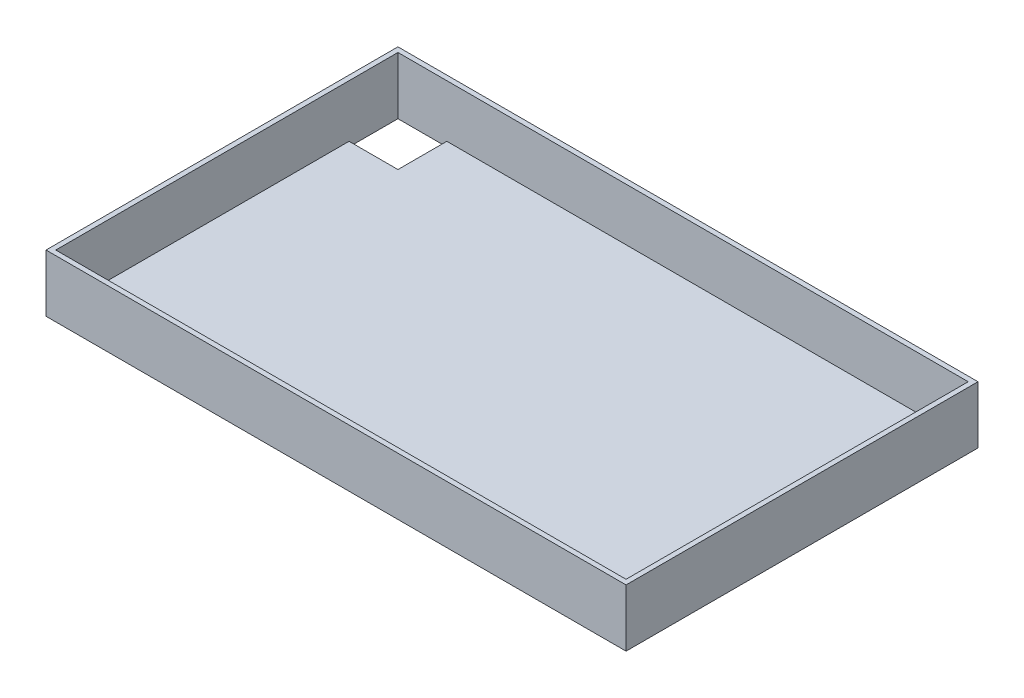
ISO-10303-21;
HEADER;
FILE_DESCRIPTION(('STEP AP214'),'2;1');
FILE_NAME('part.step','',(''),(''),'','','');
FILE_SCHEMA(('AUTOMOTIVE_DESIGN { 1 0 10303 214 1 1 1 1 }'));
ENDSEC;
DATA;
#1=APPLICATION_CONTEXT('core data for automotive mechanical design processes');
#2=APPLICATION_PROTOCOL_DEFINITION('international standard','automotive_design',2000,#1);
#3=PRODUCT_CONTEXT('',#1,'mechanical');
#4=PRODUCT('Part','Part','',(#3));
#5=PRODUCT_RELATED_PRODUCT_CATEGORY('part','',(#4));
#6=PRODUCT_DEFINITION_FORMATION('','',#4);
#7=PRODUCT_DEFINITION_CONTEXT('part definition',#1,'design');
#8=PRODUCT_DEFINITION('design','',#6,#7);
#9=PRODUCT_DEFINITION_SHAPE('','',#8);
#10=(LENGTH_UNIT() NAMED_UNIT(*) SI_UNIT(.MILLI.,.METRE.));
#11=(NAMED_UNIT(*) PLANE_ANGLE_UNIT() SI_UNIT($,.RADIAN.));
#12=(NAMED_UNIT(*) SI_UNIT($,.STERADIAN.) SOLID_ANGLE_UNIT());
#13=UNCERTAINTY_MEASURE_WITH_UNIT(LENGTH_MEASURE(1.E-05),#10,'distance_accuracy_value','');
#14=(GEOMETRIC_REPRESENTATION_CONTEXT(3) GLOBAL_UNCERTAINTY_ASSIGNED_CONTEXT((#13)) GLOBAL_UNIT_ASSIGNED_CONTEXT((#10,
#11,#12)) REPRESENTATION_CONTEXT('',''));
#15=CARTESIAN_POINT('',(0.,0.,0.));
#16=DIRECTION('',(0.,0.,1.));
#17=DIRECTION('',(1.,0.,0.));
#18=AXIS2_PLACEMENT_3D('',#15,#16,#17);
#19=CARTESIAN_POINT('',(0.,-3.,0.));
#20=DIRECTION('',(0.,1.,0.));
#21=DIRECTION('',(0.,0.,1.));
#22=AXIS2_PLACEMENT_3D('',#19,#20,#21);
#23=PLANE('',#22);
#24=DIRECTION('',(0.,0.,1.));
#25=VECTOR('',#24,1.);
#26=CARTESIAN_POINT('',(175.,-3.,105.));
#27=LINE('',#26,#25);
#28=CARTESIAN_POINT('',(175.,-3.,75.));
#29=VERTEX_POINT('',#28);
#30=CARTESIAN_POINT('',(175.,-3.,105.));
#31=VERTEX_POINT('',#30);
#32=EDGE_CURVE('E224',#29,#31,#27,.T.);
#33=ORIENTED_EDGE('',*,*,#32,.F.);
#34=DIRECTION('',(1.,0.,0.));
#35=VECTOR('',#34,1.);
#36=CARTESIAN_POINT('',(175.,-3.,75.));
#37=LINE('',#36,#35);
#38=CARTESIAN_POINT('',(145.,-3.,75.));
#39=VERTEX_POINT('',#38);
#40=EDGE_CURVE('E227',#39,#29,#37,.T.);
#41=ORIENTED_EDGE('',*,*,#40,.F.);
#42=DIRECTION('',(0.,0.,-1.));
#43=VECTOR('',#42,1.);
#44=CARTESIAN_POINT('',(145.,-3.,105.));
#45=LINE('',#44,#43);
#46=CARTESIAN_POINT('',(145.,-3.,105.));
#47=VERTEX_POINT('',#46);
#48=EDGE_CURVE('E230',#47,#39,#45,.T.);
#49=ORIENTED_EDGE('',*,*,#48,.F.);
#50=DIRECTION('',(-1.,0.,0.));
#51=VECTOR('',#50,1.);
#52=CARTESIAN_POINT('',(175.,-3.,105.));
#53=LINE('',#52,#51);
#54=EDGE_CURVE('E233',#31,#47,#53,.T.);
#55=ORIENTED_EDGE('',*,*,#54,.F.);
#56=EDGE_LOOP('',(#33,#41,#49,#55));
#57=FACE_BOUND('',#56,.T.);
#58=DIRECTION('',(1.,0.,0.));
#59=VECTOR('',#58,1.);
#60=CARTESIAN_POINT('',(175.,-3.,-75.));
#61=LINE('',#60,#59);
#62=CARTESIAN_POINT('',(145.,-3.,-75.));
#63=VERTEX_POINT('',#62);
#64=CARTESIAN_POINT('',(175.,-3.,-75.));
#65=VERTEX_POINT('',#64);
#66=EDGE_CURVE('E257',#63,#65,#61,.T.);
#67=ORIENTED_EDGE('',*,*,#66,.T.);
#68=DIRECTION('',(0.,0.,-1.));
#69=VECTOR('',#68,1.);
#70=CARTESIAN_POINT('',(175.,-3.,-105.));
#71=LINE('',#70,#69);
#72=CARTESIAN_POINT('',(175.,-3.,-105.));
#73=VERTEX_POINT('',#72);
#74=EDGE_CURVE('E247',#65,#73,#71,.T.);
#75=ORIENTED_EDGE('',*,*,#74,.T.);
#76=DIRECTION('',(-1.,0.,0.));
#77=VECTOR('',#76,1.);
#78=CARTESIAN_POINT('',(175.,-3.,-105.));
#79=LINE('',#78,#77);
#80=CARTESIAN_POINT('',(145.,-3.,-105.));
#81=VERTEX_POINT('',#80);
#82=EDGE_CURVE('E250',#73,#81,#79,.T.);
#83=ORIENTED_EDGE('',*,*,#82,.T.);
#84=DIRECTION('',(0.,0.,1.));
#85=VECTOR('',#84,1.);
#86=CARTESIAN_POINT('',(145.,-3.,-105.));
#87=LINE('',#86,#85);
#88=EDGE_CURVE('E254',#81,#63,#87,.T.);
#89=ORIENTED_EDGE('',*,*,#88,.T.);
#90=EDGE_LOOP('',(#67,#75,#83,#89));
#91=FACE_BOUND('',#90,.T.);
#92=DIRECTION('',(0.,0.,-1.));
#93=VECTOR('',#92,1.);
#94=CARTESIAN_POINT('',(178.,-3.,-105.));
#95=LINE('',#94,#93);
#96=CARTESIAN_POINT('',(178.,-3.,108.));
#97=VERTEX_POINT('',#96);
#98=CARTESIAN_POINT('',(178.,-3.,-108.));
#99=VERTEX_POINT('',#98);
#100=EDGE_CURVE('E296',#97,#99,#95,.T.);
#101=ORIENTED_EDGE('',*,*,#100,.F.);
#102=DIRECTION('',(1.,0.,0.));
#103=VECTOR('',#102,1.);
#104=CARTESIAN_POINT('',(-175.,-3.,108.));
#105=LINE('',#104,#103);
#106=CARTESIAN_POINT('',(-178.,-3.,108.));
#107=VERTEX_POINT('',#106);
#108=EDGE_CURVE('E309',#107,#97,#105,.T.);
#109=ORIENTED_EDGE('',*,*,#108,.F.);
#110=DIRECTION('',(0.,0.,1.));
#111=VECTOR('',#110,1.);
#112=CARTESIAN_POINT('',(-178.,-3.,-105.));
#113=LINE('',#112,#111);
#114=CARTESIAN_POINT('',(-178.,-3.,-108.));
#115=VERTEX_POINT('',#114);
#116=EDGE_CURVE('E305',#115,#107,#113,.T.);
#117=ORIENTED_EDGE('',*,*,#116,.F.);
#118=DIRECTION('',(-1.,0.,0.));
#119=VECTOR('',#118,1.);
#120=CARTESIAN_POINT('',(-175.,-3.,-108.));
#121=LINE('',#120,#119);
#122=EDGE_CURVE('E298',#99,#115,#121,.T.);
#123=ORIENTED_EDGE('',*,*,#122,.F.);
#124=EDGE_LOOP('',(#101,#109,#117,#123));
#125=FACE_BOUND('',#124,.T.);
#126=DIRECTION('',(-1.,0.,0.));
#127=VECTOR('',#126,1.);
#128=CARTESIAN_POINT('',(-175.,-3.,75.));
#129=LINE('',#128,#127);
#130=CARTESIAN_POINT('',(-145.,-3.,75.));
#131=VERTEX_POINT('',#130);
#132=CARTESIAN_POINT('',(-175.,-3.,75.));
#133=VERTEX_POINT('',#132);
#134=EDGE_CURVE('E210',#131,#133,#129,.T.);
#135=ORIENTED_EDGE('',*,*,#134,.T.);
#136=DIRECTION('',(0.,0.,1.));
#137=VECTOR('',#136,1.);
#138=CARTESIAN_POINT('',(-175.,-3.,105.));
#139=LINE('',#138,#137);
#140=CARTESIAN_POINT('',(-175.,-3.,105.));
#141=VERTEX_POINT('',#140);
#142=EDGE_CURVE('E202',#133,#141,#139,.T.);
#143=ORIENTED_EDGE('',*,*,#142,.T.);
#144=DIRECTION('',(1.,0.,0.));
#145=VECTOR('',#144,1.);
#146=CARTESIAN_POINT('',(-175.,-3.,105.));
#147=LINE('',#146,#145);
#148=CARTESIAN_POINT('',(-145.,-3.,105.));
#149=VERTEX_POINT('',#148);
#150=EDGE_CURVE('E205',#141,#149,#147,.T.);
#151=ORIENTED_EDGE('',*,*,#150,.T.);
#152=DIRECTION('',(0.,0.,-1.));
#153=VECTOR('',#152,1.);
#154=CARTESIAN_POINT('',(-145.,-3.,105.));
#155=LINE('',#154,#153);
#156=EDGE_CURVE('E56',#149,#131,#155,.T.);
#157=ORIENTED_EDGE('',*,*,#156,.T.);
#158=EDGE_LOOP('',(#135,#143,#151,#157));
#159=FACE_BOUND('',#158,.T.);
#160=DIRECTION('',(0.,0.,-1.));
#161=VECTOR('',#160,1.);
#162=CARTESIAN_POINT('',(-175.,-3.,-105.));
#163=LINE('',#162,#161);
#164=CARTESIAN_POINT('',(-175.,-3.,-75.));
#165=VERTEX_POINT('',#164);
#166=CARTESIAN_POINT('',(-175.,-3.,-105.));
#167=VERTEX_POINT('',#166);
#168=EDGE_CURVE('E177',#165,#167,#163,.T.);
#169=ORIENTED_EDGE('',*,*,#168,.F.);
#170=DIRECTION('',(-1.,0.,0.));
#171=VECTOR('',#170,1.);
#172=CARTESIAN_POINT('',(-175.,-3.,-75.));
#173=LINE('',#172,#171);
#174=CARTESIAN_POINT('',(-145.,-3.,-75.));
#175=VERTEX_POINT('',#174);
#176=EDGE_CURVE('E168',#175,#165,#173,.T.);
#177=ORIENTED_EDGE('',*,*,#176,.F.);
#178=DIRECTION('',(0.,0.,1.));
#179=VECTOR('',#178,1.);
#180=CARTESIAN_POINT('',(-145.,-3.,-105.));
#181=LINE('',#180,#179);
#182=CARTESIAN_POINT('',(-145.,-3.,-105.));
#183=VERTEX_POINT('',#182);
#184=EDGE_CURVE('E176',#183,#175,#181,.T.);
#185=ORIENTED_EDGE('',*,*,#184,.F.);
#186=DIRECTION('',(1.,0.,0.));
#187=VECTOR('',#186,1.);
#188=CARTESIAN_POINT('',(-175.,-3.,-105.));
#189=LINE('',#188,#187);
#190=EDGE_CURVE('E187',#167,#183,#189,.T.);
#191=ORIENTED_EDGE('',*,*,#190,.F.);
#192=EDGE_LOOP('',(#169,#177,#185,#191));
#193=FACE_BOUND('',#192,.T.);
#194=ADVANCED_FACE('F32',(#57,#91,#125,#159,#193),#23,.F.);
#195=CARTESIAN_POINT('',(0.,0.,0.));
#196=DIRECTION('',(0.,1.,0.));
#197=DIRECTION('',(0.,0.,1.));
#198=AXIS2_PLACEMENT_3D('',#195,#196,#197);
#199=PLANE('',#198);
#200=DIRECTION('',(-1.,0.,0.));
#201=VECTOR('',#200,1.);
#202=CARTESIAN_POINT('',(-175.,0.,-105.));
#203=LINE('',#202,#201);
#204=CARTESIAN_POINT('',(145.,0.,-105.));
#205=VERTEX_POINT('',#204);
#206=CARTESIAN_POINT('',(-145.,0.,-105.));
#207=VERTEX_POINT('',#206);
#208=EDGE_CURVE('E284',#205,#207,#203,.T.);
#209=ORIENTED_EDGE('',*,*,#208,.T.);
#210=DIRECTION('',(0.,0.,1.));
#211=VECTOR('',#210,1.);
#212=CARTESIAN_POINT('',(-145.,0.,-105.));
#213=LINE('',#212,#211);
#214=CARTESIAN_POINT('',(-145.,0.,-75.));
#215=VERTEX_POINT('',#214);
#216=EDGE_CURVE('E189',#207,#215,#213,.T.);
#217=ORIENTED_EDGE('',*,*,#216,.T.);
#218=DIRECTION('',(-1.,0.,0.));
#219=VECTOR('',#218,1.);
#220=CARTESIAN_POINT('',(-175.,0.,-75.));
#221=LINE('',#220,#219);
#222=CARTESIAN_POINT('',(-175.,0.,-75.));
#223=VERTEX_POINT('',#222);
#224=EDGE_CURVE('E192',#215,#223,#221,.T.);
#225=ORIENTED_EDGE('',*,*,#224,.T.);
#226=DIRECTION('',(0.,0.,1.));
#227=VECTOR('',#226,1.);
#228=CARTESIAN_POINT('',(-175.,0.,-105.));
#229=LINE('',#228,#227);
#230=CARTESIAN_POINT('',(-175.,0.,75.));
#231=VERTEX_POINT('',#230);
#232=EDGE_CURVE('E186',#223,#231,#229,.T.);
#233=ORIENTED_EDGE('',*,*,#232,.T.);
#234=DIRECTION('',(-1.,0.,0.));
#235=VECTOR('',#234,1.);
#236=CARTESIAN_POINT('',(-175.,0.,75.));
#237=LINE('',#236,#235);
#238=CARTESIAN_POINT('',(-145.,0.,75.));
#239=VERTEX_POINT('',#238);
#240=EDGE_CURVE('E206',#239,#231,#237,.T.);
#241=ORIENTED_EDGE('',*,*,#240,.F.);
#242=DIRECTION('',(0.,0.,-1.));
#243=VECTOR('',#242,1.);
#244=CARTESIAN_POINT('',(-145.,0.,105.));
#245=LINE('',#244,#243);
#246=CARTESIAN_POINT('',(-145.,0.,105.));
#247=VERTEX_POINT('',#246);
#248=EDGE_CURVE('E200',#247,#239,#245,.T.);
#249=ORIENTED_EDGE('',*,*,#248,.F.);
#250=DIRECTION('',(1.,0.,0.));
#251=VECTOR('',#250,1.);
#252=CARTESIAN_POINT('',(-175.,0.,105.));
#253=LINE('',#252,#251);
#254=CARTESIAN_POINT('',(145.,0.,105.));
#255=VERTEX_POINT('',#254);
#256=EDGE_CURVE('E275',#247,#255,#253,.T.);
#257=ORIENTED_EDGE('',*,*,#256,.T.);
#258=DIRECTION('',(0.,0.,-1.));
#259=VECTOR('',#258,1.);
#260=CARTESIAN_POINT('',(145.,0.,105.));
#261=LINE('',#260,#259);
#262=CARTESIAN_POINT('',(145.,0.,75.));
#263=VERTEX_POINT('',#262);
#264=EDGE_CURVE('E228',#255,#263,#261,.T.);
#265=ORIENTED_EDGE('',*,*,#264,.T.);
#266=DIRECTION('',(1.,0.,0.));
#267=VECTOR('',#266,1.);
#268=CARTESIAN_POINT('',(175.,0.,75.));
#269=LINE('',#268,#267);
#270=CARTESIAN_POINT('',(175.,0.,75.));
#271=VERTEX_POINT('',#270);
#272=EDGE_CURVE('E220',#263,#271,#269,.T.);
#273=ORIENTED_EDGE('',*,*,#272,.T.);
#274=DIRECTION('',(0.,0.,-1.));
#275=VECTOR('',#274,1.);
#276=CARTESIAN_POINT('',(175.,0.,-105.));
#277=LINE('',#276,#275);
#278=CARTESIAN_POINT('',(175.,0.,-75.));
#279=VERTEX_POINT('',#278);
#280=EDGE_CURVE('E267',#271,#279,#277,.T.);
#281=ORIENTED_EDGE('',*,*,#280,.T.);
#282=DIRECTION('',(1.,0.,0.));
#283=VECTOR('',#282,1.);
#284=CARTESIAN_POINT('',(175.,0.,-75.));
#285=LINE('',#284,#283);
#286=CARTESIAN_POINT('',(145.,0.,-75.));
#287=VERTEX_POINT('',#286);
#288=EDGE_CURVE('E251',#287,#279,#285,.T.);
#289=ORIENTED_EDGE('',*,*,#288,.F.);
#290=DIRECTION('',(0.,0.,1.));
#291=VECTOR('',#290,1.);
#292=CARTESIAN_POINT('',(145.,0.,-105.));
#293=LINE('',#292,#291);
#294=EDGE_CURVE('E243',#205,#287,#293,.T.);
#295=ORIENTED_EDGE('',*,*,#294,.F.);
#296=EDGE_LOOP('',(#209,#217,#225,#233,#241,#249,#257,#265,#273,#281,#289,#295));
#297=FACE_BOUND('',#296,.T.);
#298=ADVANCED_FACE('F341',(#297),#199,.T.);
#299=CARTESIAN_POINT('',(178.,32.22,-105.));
#300=DIRECTION('',(-1.,0.,0.));
#301=DIRECTION('',(0.,0.,1.));
#302=AXIS2_PLACEMENT_3D('',#299,#300,#301);
#303=PLANE('',#302);
#304=ORIENTED_EDGE('',*,*,#100,.T.);
#305=DIRECTION('',(0.,-1.,0.));
#306=VECTOR('',#305,1.);
#307=CARTESIAN_POINT('',(178.,32.22,-108.));
#308=LINE('',#307,#306);
#309=CARTESIAN_POINT('',(178.,32.22,-108.));
#310=VERTEX_POINT('',#309);
#311=EDGE_CURVE('E11',#310,#99,#308,.T.);
#312=ORIENTED_EDGE('',*,*,#311,.F.);
#313=DIRECTION('',(0.,0.,-1.));
#314=VECTOR('',#313,1.);
#315=CARTESIAN_POINT('',(178.,32.22,-105.));
#316=LINE('',#315,#314);
#317=CARTESIAN_POINT('',(178.,32.22,108.));
#318=VERTEX_POINT('',#317);
#319=EDGE_CURVE('E313',#318,#310,#316,.T.);
#320=ORIENTED_EDGE('',*,*,#319,.F.);
#321=DIRECTION('',(0.,-1.,0.));
#322=VECTOR('',#321,1.);
#323=CARTESIAN_POINT('',(178.,32.22,108.));
#324=LINE('',#323,#322);
#325=EDGE_CURVE('E300',#318,#97,#324,.T.);
#326=ORIENTED_EDGE('',*,*,#325,.T.);
#327=EDGE_LOOP('',(#304,#312,#320,#326));
#328=FACE_BOUND('',#327,.T.);
#329=ADVANCED_FACE('F331',(#328),#303,.F.);
#330=CARTESIAN_POINT('',(-175.,32.22,-108.));
#331=DIRECTION('',(0.,0.,1.));
#332=DIRECTION('',(1.,0.,0.));
#333=AXIS2_PLACEMENT_3D('',#330,#331,#332);
#334=PLANE('',#333);
#335=ORIENTED_EDGE('',*,*,#122,.T.);
#336=DIRECTION('',(0.,-1.,0.));
#337=VECTOR('',#336,1.);
#338=CARTESIAN_POINT('',(-178.,32.22,-108.));
#339=LINE('',#338,#337);
#340=CARTESIAN_POINT('',(-178.,32.22,-108.));
#341=VERTEX_POINT('',#340);
#342=EDGE_CURVE('E40',#341,#115,#339,.T.);
#343=ORIENTED_EDGE('',*,*,#342,.F.);
#344=DIRECTION('',(-1.,0.,0.));
#345=VECTOR('',#344,1.);
#346=CARTESIAN_POINT('',(-175.,32.22,-108.));
#347=LINE('',#346,#345);
#348=EDGE_CURVE('E316',#310,#341,#347,.T.);
#349=ORIENTED_EDGE('',*,*,#348,.F.);
#350=ORIENTED_EDGE('',*,*,#311,.T.);
#351=EDGE_LOOP('',(#335,#343,#349,#350));
#352=FACE_BOUND('',#351,.T.);
#353=ADVANCED_FACE('F333',(#352),#334,.F.);
#354=CARTESIAN_POINT('',(-178.,32.22,-105.));
#355=DIRECTION('',(1.,0.,0.));
#356=DIRECTION('',(0.,0.,-1.));
#357=AXIS2_PLACEMENT_3D('',#354,#355,#356);
#358=PLANE('',#357);
#359=ORIENTED_EDGE('',*,*,#116,.T.);
#360=DIRECTION('',(0.,-1.,0.));
#361=VECTOR('',#360,1.);
#362=CARTESIAN_POINT('',(-178.,32.22,108.));
#363=LINE('',#362,#361);
#364=CARTESIAN_POINT('',(-178.,32.22,108.));
#365=VERTEX_POINT('',#364);
#366=EDGE_CURVE('E303',#365,#107,#363,.T.);
#367=ORIENTED_EDGE('',*,*,#366,.F.);
#368=DIRECTION('',(0.,0.,1.));
#369=VECTOR('',#368,1.);
#370=CARTESIAN_POINT('',(-178.,32.22,-105.));
#371=LINE('',#370,#369);
#372=EDGE_CURVE('E317',#341,#365,#371,.T.);
#373=ORIENTED_EDGE('',*,*,#372,.F.);
#374=ORIENTED_EDGE('',*,*,#342,.T.);
#375=EDGE_LOOP('',(#359,#367,#373,#374));
#376=FACE_BOUND('',#375,.T.);
#377=ADVANCED_FACE('F337',(#376),#358,.F.);
#378=CARTESIAN_POINT('',(-175.,32.22,108.));
#379=DIRECTION('',(0.,0.,-1.));
#380=DIRECTION('',(-1.,0.,0.));
#381=AXIS2_PLACEMENT_3D('',#378,#379,#380);
#382=PLANE('',#381);
#383=ORIENTED_EDGE('',*,*,#108,.T.);
#384=ORIENTED_EDGE('',*,*,#325,.F.);
#385=DIRECTION('',(1.,0.,0.));
#386=VECTOR('',#385,1.);
#387=CARTESIAN_POINT('',(-175.,32.22,108.));
#388=LINE('',#387,#386);
#389=EDGE_CURVE('E35',#365,#318,#388,.T.);
#390=ORIENTED_EDGE('',*,*,#389,.F.);
#391=ORIENTED_EDGE('',*,*,#366,.T.);
#392=EDGE_LOOP('',(#383,#384,#390,#391));
#393=FACE_BOUND('',#392,.T.);
#394=ADVANCED_FACE('F327',(#393),#382,.F.);
#395=CARTESIAN_POINT('',(0.,32.22,0.));
#396=DIRECTION('',(0.,1.,0.));
#397=DIRECTION('',(0.,0.,1.));
#398=AXIS2_PLACEMENT_3D('',#395,#396,#397);
#399=PLANE('',#398);
#400=DIRECTION('',(0.,0.,-1.));
#401=VECTOR('',#400,1.);
#402=CARTESIAN_POINT('',(175.,32.22,-105.));
#403=LINE('',#402,#401);
#404=CARTESIAN_POINT('',(175.,32.22,105.));
#405=VERTEX_POINT('',#404);
#406=CARTESIAN_POINT('',(175.,32.22,-105.));
#407=VERTEX_POINT('',#406);
#408=EDGE_CURVE('E272',#405,#407,#403,.T.);
#409=ORIENTED_EDGE('',*,*,#408,.F.);
#410=DIRECTION('',(1.,0.,0.));
#411=VECTOR('',#410,1.);
#412=CARTESIAN_POINT('',(-175.,32.22,105.));
#413=LINE('',#412,#411);
#414=CARTESIAN_POINT('',(-175.,32.22,105.));
#415=VERTEX_POINT('',#414);
#416=EDGE_CURVE('E280',#415,#405,#413,.T.);
#417=ORIENTED_EDGE('',*,*,#416,.F.);
#418=DIRECTION('',(0.,0.,1.));
#419=VECTOR('',#418,1.);
#420=CARTESIAN_POINT('',(-175.,32.22,-105.));
#421=LINE('',#420,#419);
#422=CARTESIAN_POINT('',(-175.,32.22,-105.));
#423=VERTEX_POINT('',#422);
#424=EDGE_CURVE('E277',#423,#415,#421,.T.);
#425=ORIENTED_EDGE('',*,*,#424,.F.);
#426=DIRECTION('',(-1.,0.,0.));
#427=VECTOR('',#426,1.);
#428=CARTESIAN_POINT('',(-175.,32.22,-105.));
#429=LINE('',#428,#427);
#430=EDGE_CURVE('E274',#407,#423,#429,.T.);
#431=ORIENTED_EDGE('',*,*,#430,.F.);
#432=EDGE_LOOP('',(#409,#417,#425,#431));
#433=FACE_BOUND('',#432,.T.);
#434=ORIENTED_EDGE('',*,*,#319,.T.);
#435=ORIENTED_EDGE('',*,*,#348,.T.);
#436=ORIENTED_EDGE('',*,*,#372,.T.);
#437=ORIENTED_EDGE('',*,*,#389,.T.);
#438=EDGE_LOOP('',(#434,#435,#436,#437));
#439=FACE_BOUND('',#438,.T.);
#440=ADVANCED_FACE('F323',(#433,#439),#399,.T.);
#441=CARTESIAN_POINT('',(175.,32.22,-105.));
#442=DIRECTION('',(-1.,0.,0.));
#443=DIRECTION('',(0.,0.,1.));
#444=AXIS2_PLACEMENT_3D('',#441,#442,#443);
#445=PLANE('',#444);
#446=ORIENTED_EDGE('',*,*,#280,.F.);
#447=DIRECTION('',(0.,1.,0.));
#448=VECTOR('',#447,1.);
#449=CARTESIAN_POINT('',(175.,-3.,75.));
#450=LINE('',#449,#448);
#451=EDGE_CURVE('E235',#29,#271,#450,.T.);
#452=ORIENTED_EDGE('',*,*,#451,.F.);
#453=ORIENTED_EDGE('',*,*,#32,.T.);
#454=DIRECTION('',(0.,-1.,0.));
#455=VECTOR('',#454,1.);
#456=CARTESIAN_POINT('',(175.,32.22,105.));
#457=LINE('',#456,#455);
#458=EDGE_CURVE('E282',#405,#31,#457,.T.);
#459=ORIENTED_EDGE('',*,*,#458,.F.);
#460=ORIENTED_EDGE('',*,*,#408,.T.);
#461=DIRECTION('',(0.,-1.,0.));
#462=VECTOR('',#461,1.);
#463=CARTESIAN_POINT('',(175.,32.22,-105.));
#464=LINE('',#463,#462);
#465=EDGE_CURVE('E294',#407,#73,#464,.T.);
#466=ORIENTED_EDGE('',*,*,#465,.T.);
#467=ORIENTED_EDGE('',*,*,#74,.F.);
#468=DIRECTION('',(0.,1.,0.));
#469=VECTOR('',#468,1.);
#470=CARTESIAN_POINT('',(175.,-3.,-75.));
#471=LINE('',#470,#469);
#472=EDGE_CURVE('E264',#65,#279,#471,.T.);
#473=ORIENTED_EDGE('',*,*,#472,.T.);
#474=EDGE_LOOP('',(#446,#452,#453,#459,#460,#466,#467,#473));
#475=FACE_BOUND('',#474,.T.);
#476=ADVANCED_FACE('F373',(#475),#445,.T.);
#477=CARTESIAN_POINT('',(-175.,32.22,-105.));
#478=DIRECTION('',(0.,0.,1.));
#479=DIRECTION('',(1.,0.,0.));
#480=AXIS2_PLACEMENT_3D('',#477,#478,#479);
#481=PLANE('',#480);
#482=ORIENTED_EDGE('',*,*,#208,.F.);
#483=DIRECTION('',(0.,1.,0.));
#484=VECTOR('',#483,1.);
#485=CARTESIAN_POINT('',(145.,-3.,-105.));
#486=LINE('',#485,#484);
#487=EDGE_CURVE('E260',#81,#205,#486,.T.);
#488=ORIENTED_EDGE('',*,*,#487,.F.);
#489=ORIENTED_EDGE('',*,*,#82,.F.);
#490=ORIENTED_EDGE('',*,*,#465,.F.);
#491=ORIENTED_EDGE('',*,*,#430,.T.);
#492=DIRECTION('',(0.,-1.,0.));
#493=VECTOR('',#492,1.);
#494=CARTESIAN_POINT('',(-175.,32.22,-105.));
#495=LINE('',#494,#493);
#496=EDGE_CURVE('E292',#423,#167,#495,.T.);
#497=ORIENTED_EDGE('',*,*,#496,.T.);
#498=ORIENTED_EDGE('',*,*,#190,.T.);
#499=DIRECTION('',(0.,1.,0.));
#500=VECTOR('',#499,1.);
#501=CARTESIAN_POINT('',(-145.,-3.,-105.));
#502=LINE('',#501,#500);
#503=EDGE_CURVE('E198',#183,#207,#502,.T.);
#504=ORIENTED_EDGE('',*,*,#503,.T.);
#505=EDGE_LOOP('',(#482,#488,#489,#490,#491,#497,#498,#504));
#506=FACE_BOUND('',#505,.T.);
#507=ADVANCED_FACE('F364',(#506),#481,.T.);
#508=CARTESIAN_POINT('',(-175.,32.22,-105.));
#509=DIRECTION('',(1.,0.,0.));
#510=DIRECTION('',(0.,0.,-1.));
#511=AXIS2_PLACEMENT_3D('',#508,#509,#510);
#512=PLANE('',#511);
#513=ORIENTED_EDGE('',*,*,#232,.F.);
#514=DIRECTION('',(0.,1.,0.));
#515=VECTOR('',#514,1.);
#516=CARTESIAN_POINT('',(-175.,-3.,-75.));
#517=LINE('',#516,#515);
#518=EDGE_CURVE('E171',#165,#223,#517,.T.);
#519=ORIENTED_EDGE('',*,*,#518,.F.);
#520=ORIENTED_EDGE('',*,*,#168,.T.);
#521=ORIENTED_EDGE('',*,*,#496,.F.);
#522=ORIENTED_EDGE('',*,*,#424,.T.);
#523=DIRECTION('',(0.,-1.,0.));
#524=VECTOR('',#523,1.);
#525=CARTESIAN_POINT('',(-175.,32.22,105.));
#526=LINE('',#525,#524);
#527=EDGE_CURVE('E290',#415,#141,#526,.T.);
#528=ORIENTED_EDGE('',*,*,#527,.T.);
#529=ORIENTED_EDGE('',*,*,#142,.F.);
#530=DIRECTION('',(0.,1.,0.));
#531=VECTOR('',#530,1.);
#532=CARTESIAN_POINT('',(-175.,-3.,75.));
#533=LINE('',#532,#531);
#534=EDGE_CURVE('E218',#133,#231,#533,.T.);
#535=ORIENTED_EDGE('',*,*,#534,.T.);
#536=EDGE_LOOP('',(#513,#519,#520,#521,#522,#528,#529,#535));
#537=FACE_BOUND('',#536,.T.);
#538=ADVANCED_FACE('F182',(#537),#512,.T.);
#539=CARTESIAN_POINT('',(-175.,32.22,105.));
#540=DIRECTION('',(0.,0.,-1.));
#541=DIRECTION('',(-1.,0.,0.));
#542=AXIS2_PLACEMENT_3D('',#539,#540,#541);
#543=PLANE('',#542);
#544=ORIENTED_EDGE('',*,*,#256,.F.);
#545=DIRECTION('',(0.,1.,0.));
#546=VECTOR('',#545,1.);
#547=CARTESIAN_POINT('',(-145.,-3.,105.));
#548=LINE('',#547,#546);
#549=EDGE_CURVE('E213',#149,#247,#548,.T.);
#550=ORIENTED_EDGE('',*,*,#549,.F.);
#551=ORIENTED_EDGE('',*,*,#150,.F.);
#552=ORIENTED_EDGE('',*,*,#527,.F.);
#553=ORIENTED_EDGE('',*,*,#416,.T.);
#554=ORIENTED_EDGE('',*,*,#458,.T.);
#555=ORIENTED_EDGE('',*,*,#54,.T.);
#556=DIRECTION('',(0.,1.,0.));
#557=VECTOR('',#556,1.);
#558=CARTESIAN_POINT('',(145.,-3.,105.));
#559=LINE('',#558,#557);
#560=EDGE_CURVE('E240',#47,#255,#559,.T.);
#561=ORIENTED_EDGE('',*,*,#560,.T.);
#562=EDGE_LOOP('',(#544,#550,#551,#552,#553,#554,#555,#561));
#563=FACE_BOUND('',#562,.T.);
#564=ADVANCED_FACE('F353',(#563),#543,.T.);
#565=CARTESIAN_POINT('',(175.,-3.,-75.));
#566=DIRECTION('',(0.,0.,1.));
#567=DIRECTION('',(1.,0.,0.));
#568=AXIS2_PLACEMENT_3D('',#565,#566,#567);
#569=PLANE('',#568);
#570=ORIENTED_EDGE('',*,*,#288,.T.);
#571=ORIENTED_EDGE('',*,*,#472,.F.);
#572=ORIENTED_EDGE('',*,*,#66,.F.);
#573=DIRECTION('',(0.,1.,0.));
#574=VECTOR('',#573,1.);
#575=CARTESIAN_POINT('',(145.,-3.,-75.));
#576=LINE('',#575,#574);
#577=EDGE_CURVE('E268',#63,#287,#576,.T.);
#578=ORIENTED_EDGE('',*,*,#577,.T.);
#579=EDGE_LOOP('',(#570,#571,#572,#578));
#580=FACE_BOUND('',#579,.T.);
#581=ADVANCED_FACE('F390',(#580),#569,.F.);
#582=CARTESIAN_POINT('',(145.,-3.,-105.));
#583=DIRECTION('',(-1.,0.,0.));
#584=DIRECTION('',(0.,0.,1.));
#585=AXIS2_PLACEMENT_3D('',#582,#583,#584);
#586=PLANE('',#585);
#587=ORIENTED_EDGE('',*,*,#294,.T.);
#588=ORIENTED_EDGE('',*,*,#577,.F.);
#589=ORIENTED_EDGE('',*,*,#88,.F.);
#590=ORIENTED_EDGE('',*,*,#487,.T.);
#591=EDGE_LOOP('',(#587,#588,#589,#590));
#592=FACE_BOUND('',#591,.T.);
#593=ADVANCED_FACE('F392',(#592),#586,.F.);
#594=CARTESIAN_POINT('',(145.,-3.,105.));
#595=DIRECTION('',(1.,0.,0.));
#596=DIRECTION('',(0.,0.,-1.));
#597=AXIS2_PLACEMENT_3D('',#594,#595,#596);
#598=PLANE('',#597);
#599=ORIENTED_EDGE('',*,*,#264,.F.);
#600=ORIENTED_EDGE('',*,*,#560,.F.);
#601=ORIENTED_EDGE('',*,*,#48,.T.);
#602=DIRECTION('',(0.,1.,0.));
#603=VECTOR('',#602,1.);
#604=CARTESIAN_POINT('',(145.,-3.,75.));
#605=LINE('',#604,#603);
#606=EDGE_CURVE('E244',#39,#263,#605,.T.);
#607=ORIENTED_EDGE('',*,*,#606,.T.);
#608=EDGE_LOOP('',(#599,#600,#601,#607));
#609=FACE_BOUND('',#608,.T.);
#610=ADVANCED_FACE('F383',(#609),#598,.T.);
#611=CARTESIAN_POINT('',(175.,-3.,75.));
#612=DIRECTION('',(0.,0.,1.));
#613=DIRECTION('',(1.,0.,0.));
#614=AXIS2_PLACEMENT_3D('',#611,#612,#613);
#615=PLANE('',#614);
#616=ORIENTED_EDGE('',*,*,#272,.F.);
#617=ORIENTED_EDGE('',*,*,#606,.F.);
#618=ORIENTED_EDGE('',*,*,#40,.T.);
#619=ORIENTED_EDGE('',*,*,#451,.T.);
#620=EDGE_LOOP('',(#616,#617,#618,#619));
#621=FACE_BOUND('',#620,.T.);
#622=ADVANCED_FACE('F400',(#621),#615,.T.);
#623=CARTESIAN_POINT('',(-175.,-3.,75.));
#624=DIRECTION('',(0.,0.,-1.));
#625=DIRECTION('',(-1.,0.,0.));
#626=AXIS2_PLACEMENT_3D('',#623,#624,#625);
#627=PLANE('',#626);
#628=ORIENTED_EDGE('',*,*,#240,.T.);
#629=ORIENTED_EDGE('',*,*,#534,.F.);
#630=ORIENTED_EDGE('',*,*,#134,.F.);
#631=DIRECTION('',(0.,1.,0.));
#632=VECTOR('',#631,1.);
#633=CARTESIAN_POINT('',(-145.,-3.,75.));
#634=LINE('',#633,#632);
#635=EDGE_CURVE('E221',#131,#239,#634,.T.);
#636=ORIENTED_EDGE('',*,*,#635,.T.);
#637=EDGE_LOOP('',(#628,#629,#630,#636));
#638=FACE_BOUND('',#637,.T.);
#639=ADVANCED_FACE('F346',(#638),#627,.F.);
#640=CARTESIAN_POINT('',(-145.,-3.,105.));
#641=DIRECTION('',(1.,0.,0.));
#642=DIRECTION('',(0.,0.,-1.));
#643=AXIS2_PLACEMENT_3D('',#640,#641,#642);
#644=PLANE('',#643);
#645=ORIENTED_EDGE('',*,*,#248,.T.);
#646=ORIENTED_EDGE('',*,*,#635,.F.);
#647=ORIENTED_EDGE('',*,*,#156,.F.);
#648=ORIENTED_EDGE('',*,*,#549,.T.);
#649=EDGE_LOOP('',(#645,#646,#647,#648));
#650=FACE_BOUND('',#649,.T.);
#651=ADVANCED_FACE('F355',(#650),#644,.F.);
#652=CARTESIAN_POINT('',(-145.,-3.,-105.));
#653=DIRECTION('',(-1.,0.,0.));
#654=DIRECTION('',(0.,0.,1.));
#655=AXIS2_PLACEMENT_3D('',#652,#653,#654);
#656=PLANE('',#655);
#657=ORIENTED_EDGE('',*,*,#216,.F.);
#658=ORIENTED_EDGE('',*,*,#503,.F.);
#659=ORIENTED_EDGE('',*,*,#184,.T.);
#660=DIRECTION('',(0.,1.,0.));
#661=VECTOR('',#660,1.);
#662=CARTESIAN_POINT('',(-145.,-3.,-75.));
#663=LINE('',#662,#661);
#664=EDGE_CURVE('E48',#175,#215,#663,.T.);
#665=ORIENTED_EDGE('',*,*,#664,.T.);
#666=EDGE_LOOP('',(#657,#658,#659,#665));
#667=FACE_BOUND('',#666,.T.);
#668=ADVANCED_FACE('F362',(#667),#656,.T.);
#669=CARTESIAN_POINT('',(-175.,-3.,-75.));
#670=DIRECTION('',(0.,0.,-1.));
#671=DIRECTION('',(-1.,0.,0.));
#672=AXIS2_PLACEMENT_3D('',#669,#670,#671);
#673=PLANE('',#672);
#674=ORIENTED_EDGE('',*,*,#224,.F.);
#675=ORIENTED_EDGE('',*,*,#664,.F.);
#676=ORIENTED_EDGE('',*,*,#176,.T.);
#677=ORIENTED_EDGE('',*,*,#518,.T.);
#678=EDGE_LOOP('',(#674,#675,#676,#677));
#679=FACE_BOUND('',#678,.T.);
#680=ADVANCED_FACE('F170',(#679),#673,.T.);
#681=CLOSED_SHELL('',(#194,#298,#329,#353,#377,#394,#440,#476,#507,#538,#564,#581,#593,#610,
#622,#639,#651,#668,#680));
#682=MANIFOLD_SOLID_BREP('B2',#681);
#683=ADVANCED_BREP_SHAPE_REPRESENTATION('',(#18,#682),#14);
#684=SHAPE_DEFINITION_REPRESENTATION(#9,#683);
ENDSEC;
END-ISO-10303-21;
